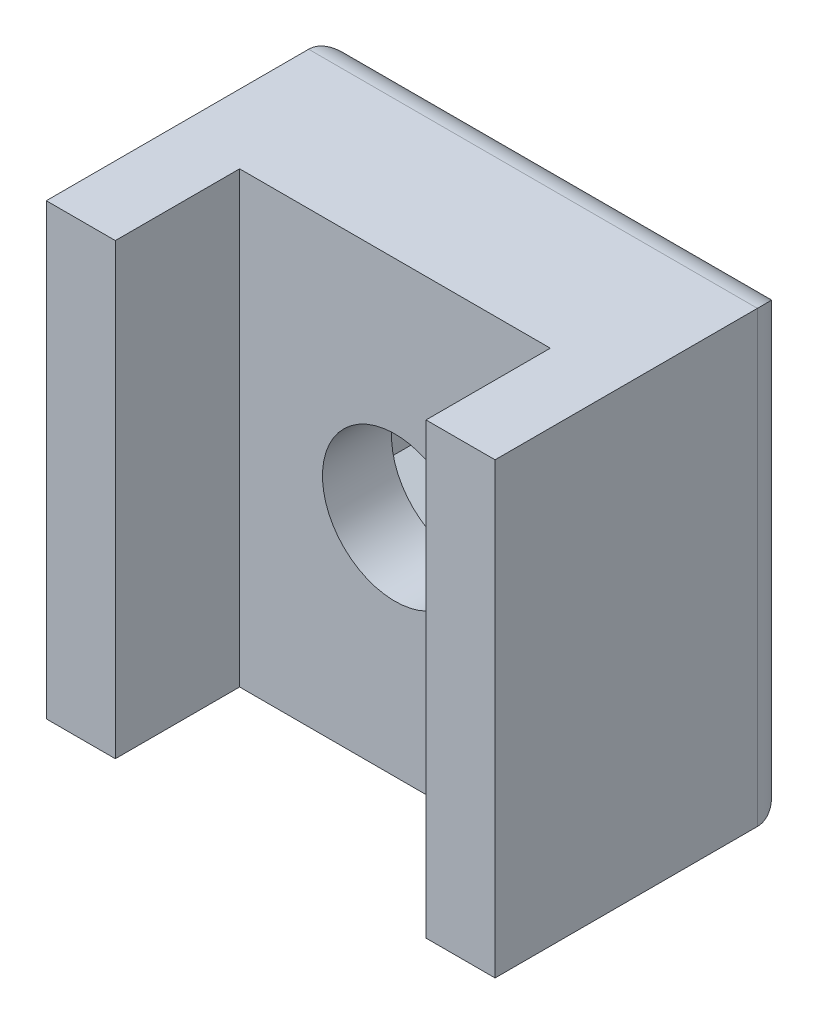
ISO-10303-21;
HEADER;
FILE_DESCRIPTION(('STEP AP214'),'2;1');
FILE_NAME('part.step','',(''),(''),'','','');
FILE_SCHEMA(('AUTOMOTIVE_DESIGN { 1 0 10303 214 1 1 1 1 }'));
ENDSEC;
DATA;
#1=APPLICATION_CONTEXT('core data for automotive mechanical design processes');
#2=APPLICATION_PROTOCOL_DEFINITION('international standard','automotive_design',2000,#1);
#3=PRODUCT_CONTEXT('',#1,'mechanical');
#4=PRODUCT('Part','Part','',(#3));
#5=PRODUCT_RELATED_PRODUCT_CATEGORY('part','',(#4));
#6=PRODUCT_DEFINITION_FORMATION('','',#4);
#7=PRODUCT_DEFINITION_CONTEXT('part definition',#1,'design');
#8=PRODUCT_DEFINITION('design','',#6,#7);
#9=PRODUCT_DEFINITION_SHAPE('','',#8);
#10=(LENGTH_UNIT() NAMED_UNIT(*) SI_UNIT(.MILLI.,.METRE.));
#11=(NAMED_UNIT(*) PLANE_ANGLE_UNIT() SI_UNIT($,.RADIAN.));
#12=(NAMED_UNIT(*) SI_UNIT($,.STERADIAN.) SOLID_ANGLE_UNIT());
#13=UNCERTAINTY_MEASURE_WITH_UNIT(LENGTH_MEASURE(1.E-05),#10,'distance_accuracy_value','');
#14=(GEOMETRIC_REPRESENTATION_CONTEXT(3) GLOBAL_UNCERTAINTY_ASSIGNED_CONTEXT((#13)) GLOBAL_UNIT_ASSIGNED_CONTEXT((#10,
#11,#12)) REPRESENTATION_CONTEXT('',''));
#15=CARTESIAN_POINT('',(0.,0.,0.));
#16=DIRECTION('',(0.,0.,1.));
#17=DIRECTION('',(1.,0.,0.));
#18=AXIS2_PLACEMENT_3D('',#15,#16,#17);
#19=CARTESIAN_POINT('',(0.,0.,5.6));
#20=DIRECTION('',(0.,0.,-1.));
#21=DIRECTION('',(-1.,0.,0.));
#22=AXIS2_PLACEMENT_3D('',#19,#20,#21);
#23=PLANE('',#22);
#24=DIRECTION('',(-1.,0.,0.));
#25=VECTOR('',#24,1.);
#26=CARTESIAN_POINT('',(-6.5,6.5,5.6));
#27=LINE('',#26,#25);
#28=CARTESIAN_POINT('',(6.5,6.5,5.6));
#29=VERTEX_POINT('',#28);
#30=CARTESIAN_POINT('',(4.5,6.5,5.6));
#31=VERTEX_POINT('',#30);
#32=EDGE_CURVE('E242',#29,#31,#27,.T.);
#33=ORIENTED_EDGE('',*,*,#32,.T.);
#34=DIRECTION('',(0.,1.,0.));
#35=VECTOR('',#34,1.);
#36=CARTESIAN_POINT('',(4.5,-6.5,5.6));
#37=LINE('',#36,#35);
#38=CARTESIAN_POINT('',(4.5,-6.5,5.6));
#39=VERTEX_POINT('',#38);
#40=EDGE_CURVE('E210',#39,#31,#37,.T.);
#41=ORIENTED_EDGE('',*,*,#40,.F.);
#42=DIRECTION('',(1.,0.,0.));
#43=VECTOR('',#42,1.);
#44=CARTESIAN_POINT('',(-6.5,-6.5,5.6));
#45=LINE('',#44,#43);
#46=CARTESIAN_POINT('',(6.5,-6.5,5.6));
#47=VERTEX_POINT('',#46);
#48=EDGE_CURVE('E247',#39,#47,#45,.T.);
#49=ORIENTED_EDGE('',*,*,#48,.T.);
#50=DIRECTION('',(0.,1.,0.));
#51=VECTOR('',#50,1.);
#52=CARTESIAN_POINT('',(6.5,-6.5,5.6));
#53=LINE('',#52,#51);
#54=EDGE_CURVE('E231',#47,#29,#53,.T.);
#55=ORIENTED_EDGE('',*,*,#54,.T.);
#56=EDGE_LOOP('',(#33,#41,#49,#55));
#57=FACE_BOUND('',#56,.T.);
#58=ADVANCED_FACE('F33',(#57),#23,.F.);
#59=CARTESIAN_POINT('',(6.5,-6.5,5.6));
#60=DIRECTION('',(-1.,0.,0.));
#61=DIRECTION('',(0.,0.,1.));
#62=AXIS2_PLACEMENT_3D('',#59,#60,#61);
#63=PLANE('',#62);
#64=DIRECTION('',(0.,0.,-1.));
#65=VECTOR('',#64,1.);
#66=CARTESIAN_POINT('',(6.5,-6.5,5.6));
#67=LINE('',#66,#65);
#68=CARTESIAN_POINT('',(6.5,-6.5,-2.));
#69=VERTEX_POINT('',#68);
#70=EDGE_CURVE('E251',#47,#69,#67,.T.);
#71=ORIENTED_EDGE('',*,*,#70,.T.);
#72=DIRECTION('',(0.,-1.,0.));
#73=VECTOR('',#72,1.);
#74=CARTESIAN_POINT('',(6.5,6.5,-2.));
#75=LINE('',#74,#73);
#76=CARTESIAN_POINT('',(6.5,6.5,-2.));
#77=VERTEX_POINT('',#76);
#78=EDGE_CURVE('E50',#69,#77,#75,.F.);
#79=ORIENTED_EDGE('',*,*,#78,.T.);
#80=DIRECTION('',(0.,0.,-1.));
#81=VECTOR('',#80,1.);
#82=CARTESIAN_POINT('',(6.5,6.5,5.6));
#83=LINE('',#82,#81);
#84=EDGE_CURVE('E258',#29,#77,#83,.T.);
#85=ORIENTED_EDGE('',*,*,#84,.F.);
#86=ORIENTED_EDGE('',*,*,#54,.F.);
#87=EDGE_LOOP('',(#71,#79,#85,#86));
#88=FACE_BOUND('',#87,.T.);
#89=ADVANCED_FACE('F318',(#88),#63,.F.);
#90=CARTESIAN_POINT('',(-6.5,6.5,5.6));
#91=DIRECTION('',(0.,-1.,0.));
#92=DIRECTION('',(0.,0.,-1.));
#93=AXIS2_PLACEMENT_3D('',#90,#91,#92);
#94=PLANE('',#93);
#95=ORIENTED_EDGE('',*,*,#84,.T.);
#96=DIRECTION('',(1.,0.,0.));
#97=VECTOR('',#96,1.);
#98=CARTESIAN_POINT('',(-6.5,6.5,-2.));
#99=LINE('',#98,#97);
#100=CARTESIAN_POINT('',(-6.5,6.5,-2.));
#101=VERTEX_POINT('',#100);
#102=EDGE_CURVE('E11',#77,#101,#99,.F.);
#103=ORIENTED_EDGE('',*,*,#102,.T.);
#104=DIRECTION('',(0.,0.,-1.));
#105=VECTOR('',#104,1.);
#106=CARTESIAN_POINT('',(-6.5,6.5,5.6));
#107=LINE('',#106,#105);
#108=CARTESIAN_POINT('',(-6.5,6.5,5.6));
#109=VERTEX_POINT('',#108);
#110=EDGE_CURVE('E255',#109,#101,#107,.T.);
#111=ORIENTED_EDGE('',*,*,#110,.F.);
#112=CARTESIAN_POINT('',(-4.5,6.5,5.6));
#113=VERTEX_POINT('',#112);
#114=EDGE_CURVE('E241',#113,#109,#27,.T.);
#115=ORIENTED_EDGE('',*,*,#114,.F.);
#116=DIRECTION('',(0.,0.,1.));
#117=VECTOR('',#116,1.);
#118=CARTESIAN_POINT('',(-4.5,6.5,2.));
#119=LINE('',#118,#117);
#120=CARTESIAN_POINT('',(-4.5,6.5,2.));
#121=VERTEX_POINT('',#120);
#122=EDGE_CURVE('E235',#121,#113,#119,.T.);
#123=ORIENTED_EDGE('',*,*,#122,.F.);
#124=DIRECTION('',(-1.,0.,0.));
#125=VECTOR('',#124,1.);
#126=CARTESIAN_POINT('',(-4.5,6.5,2.));
#127=LINE('',#126,#125);
#128=CARTESIAN_POINT('',(4.5,6.5,2.));
#129=VERTEX_POINT('',#128);
#130=EDGE_CURVE('E216',#129,#121,#127,.T.);
#131=ORIENTED_EDGE('',*,*,#130,.F.);
#132=DIRECTION('',(0.,0.,1.));
#133=VECTOR('',#132,1.);
#134=CARTESIAN_POINT('',(4.5,6.5,2.));
#135=LINE('',#134,#133);
#136=EDGE_CURVE('E226',#129,#31,#135,.T.);
#137=ORIENTED_EDGE('',*,*,#136,.T.);
#138=ORIENTED_EDGE('',*,*,#32,.F.);
#139=EDGE_LOOP('',(#95,#103,#111,#115,#123,#131,#137,#138));
#140=FACE_BOUND('',#139,.T.);
#141=ADVANCED_FACE('F295',(#140),#94,.F.);
#142=CARTESIAN_POINT('',(-6.5,-6.5,5.6));
#143=DIRECTION('',(1.,0.,0.));
#144=DIRECTION('',(0.,0.,-1.));
#145=AXIS2_PLACEMENT_3D('',#142,#143,#144);
#146=PLANE('',#145);
#147=ORIENTED_EDGE('',*,*,#110,.T.);
#148=DIRECTION('',(0.,1.,0.));
#149=VECTOR('',#148,1.);
#150=CARTESIAN_POINT('',(-6.5,-6.5,-2.));
#151=LINE('',#150,#149);
#152=CARTESIAN_POINT('',(-6.5,-6.5,-2.));
#153=VERTEX_POINT('',#152);
#154=EDGE_CURVE('E269',#101,#153,#151,.F.);
#155=ORIENTED_EDGE('',*,*,#154,.T.);
#156=DIRECTION('',(0.,0.,-1.));
#157=VECTOR('',#156,1.);
#158=CARTESIAN_POINT('',(-6.5,-6.5,5.6));
#159=LINE('',#158,#157);
#160=CARTESIAN_POINT('',(-6.5,-6.5,5.6));
#161=VERTEX_POINT('',#160);
#162=EDGE_CURVE('E253',#161,#153,#159,.T.);
#163=ORIENTED_EDGE('',*,*,#162,.F.);
#164=DIRECTION('',(0.,-1.,0.));
#165=VECTOR('',#164,1.);
#166=CARTESIAN_POINT('',(-6.5,-6.5,5.6));
#167=LINE('',#166,#165);
#168=EDGE_CURVE('E245',#109,#161,#167,.T.);
#169=ORIENTED_EDGE('',*,*,#168,.F.);
#170=EDGE_LOOP('',(#147,#155,#163,#169));
#171=FACE_BOUND('',#170,.T.);
#172=ADVANCED_FACE('F300',(#171),#146,.F.);
#173=CARTESIAN_POINT('',(-6.5,-6.5,5.6));
#174=DIRECTION('',(0.,1.,0.));
#175=DIRECTION('',(0.,0.,1.));
#176=AXIS2_PLACEMENT_3D('',#173,#174,#175);
#177=PLANE('',#176);
#178=ORIENTED_EDGE('',*,*,#162,.T.);
#179=DIRECTION('',(-1.,0.,0.));
#180=VECTOR('',#179,1.);
#181=CARTESIAN_POINT('',(6.5,-6.5,-2.));
#182=LINE('',#181,#180);
#183=EDGE_CURVE('E42',#153,#69,#182,.F.);
#184=ORIENTED_EDGE('',*,*,#183,.T.);
#185=ORIENTED_EDGE('',*,*,#70,.F.);
#186=ORIENTED_EDGE('',*,*,#48,.F.);
#187=DIRECTION('',(0.,0.,1.));
#188=VECTOR('',#187,1.);
#189=CARTESIAN_POINT('',(4.5,-6.5,2.));
#190=LINE('',#189,#188);
#191=CARTESIAN_POINT('',(4.5,-6.5,2.));
#192=VERTEX_POINT('',#191);
#193=EDGE_CURVE('E229',#192,#39,#190,.T.);
#194=ORIENTED_EDGE('',*,*,#193,.F.);
#195=DIRECTION('',(1.,0.,0.));
#196=VECTOR('',#195,1.);
#197=CARTESIAN_POINT('',(-4.5,-6.5,2.));
#198=LINE('',#197,#196);
#199=CARTESIAN_POINT('',(-4.5,-6.5,2.));
#200=VERTEX_POINT('',#199);
#201=EDGE_CURVE('E223',#200,#192,#198,.T.);
#202=ORIENTED_EDGE('',*,*,#201,.F.);
#203=DIRECTION('',(0.,0.,1.));
#204=VECTOR('',#203,1.);
#205=CARTESIAN_POINT('',(-4.5,-6.5,2.));
#206=LINE('',#205,#204);
#207=CARTESIAN_POINT('',(-4.5,-6.5,5.6));
#208=VERTEX_POINT('',#207);
#209=EDGE_CURVE('E232',#200,#208,#206,.T.);
#210=ORIENTED_EDGE('',*,*,#209,.T.);
#211=EDGE_CURVE('E248',#161,#208,#45,.T.);
#212=ORIENTED_EDGE('',*,*,#211,.F.);
#213=EDGE_LOOP('',(#178,#184,#185,#186,#194,#202,#210,#212));
#214=FACE_BOUND('',#213,.T.);
#215=ADVANCED_FACE('F330',(#214),#177,.F.);
#216=ORIENTED_EDGE('',*,*,#211,.T.);
#217=DIRECTION('',(0.,-1.,0.));
#218=VECTOR('',#217,1.);
#219=CARTESIAN_POINT('',(-4.5,-6.5,5.6));
#220=LINE('',#219,#218);
#221=EDGE_CURVE('E217',#113,#208,#220,.T.);
#222=ORIENTED_EDGE('',*,*,#221,.F.);
#223=ORIENTED_EDGE('',*,*,#114,.T.);
#224=ORIENTED_EDGE('',*,*,#168,.T.);
#225=EDGE_LOOP('',(#216,#222,#223,#224));
#226=FACE_BOUND('',#225,.T.);
#227=ADVANCED_FACE('F321',(#226),#23,.F.);
#228=CARTESIAN_POINT('',(0.,0.,0.));
#229=DIRECTION('',(0.,0.,-1.));
#230=DIRECTION('',(-1.,0.,0.));
#231=AXIS2_PLACEMENT_3D('',#228,#229,#230);
#232=PLANE('',#231);
#233=DIRECTION('',(0.,-1.,0.));
#234=VECTOR('',#233,1.);
#235=CARTESIAN_POINT('',(3.75,2.1650635094611,0.));
#236=LINE('',#235,#234);
#237=CARTESIAN_POINT('',(3.75,2.1650635094611,0.));
#238=VERTEX_POINT('',#237);
#239=CARTESIAN_POINT('',(3.75,-2.1650635094611,0.));
#240=VERTEX_POINT('',#239);
#241=EDGE_CURVE('E186',#238,#240,#236,.T.);
#242=ORIENTED_EDGE('',*,*,#241,.T.);
#243=DIRECTION('',(-0.866025403784438,-0.5,0.));
#244=VECTOR('',#243,1.);
#245=CARTESIAN_POINT('',(3.75,-2.1650635094611,0.));
#246=LINE('',#245,#244);
#247=CARTESIAN_POINT('',(0.,-4.33012701892219,0.));
#248=VERTEX_POINT('',#247);
#249=EDGE_CURVE('E168',#240,#248,#246,.T.);
#250=ORIENTED_EDGE('',*,*,#249,.T.);
#251=DIRECTION('',(-0.866025403784439,0.5,0.));
#252=VECTOR('',#251,1.);
#253=CARTESIAN_POINT('',(0.,-4.33012701892219,0.));
#254=LINE('',#253,#252);
#255=CARTESIAN_POINT('',(-3.75,-2.1650635094611,0.));
#256=VERTEX_POINT('',#255);
#257=EDGE_CURVE('E189',#248,#256,#254,.T.);
#258=ORIENTED_EDGE('',*,*,#257,.T.);
#259=DIRECTION('',(0.,1.,0.));
#260=VECTOR('',#259,1.);
#261=CARTESIAN_POINT('',(-3.75,-2.1650635094611,0.));
#262=LINE('',#261,#260);
#263=CARTESIAN_POINT('',(-3.75,2.1650635094611,0.));
#264=VERTEX_POINT('',#263);
#265=EDGE_CURVE('E191',#256,#264,#262,.T.);
#266=ORIENTED_EDGE('',*,*,#265,.T.);
#267=DIRECTION('',(0.866025403784438,0.500000000000001,0.));
#268=VECTOR('',#267,1.);
#269=CARTESIAN_POINT('',(-3.75,2.1650635094611,0.));
#270=LINE('',#269,#268);
#271=CARTESIAN_POINT('',(0.,4.3301270189222,0.));
#272=VERTEX_POINT('',#271);
#273=EDGE_CURVE('E193',#264,#272,#270,.T.);
#274=ORIENTED_EDGE('',*,*,#273,.T.);
#275=DIRECTION('',(0.866025403784439,-0.5,0.));
#276=VECTOR('',#275,1.);
#277=CARTESIAN_POINT('',(0.,4.3301270189222,0.));
#278=LINE('',#277,#276);
#279=EDGE_CURVE('E161',#272,#238,#278,.T.);
#280=ORIENTED_EDGE('',*,*,#279,.T.);
#281=EDGE_LOOP('',(#242,#250,#258,#266,#274,#280));
#282=FACE_BOUND('',#281,.T.);
#283=CARTESIAN_POINT('',(0.,0.,0.));
#284=DIRECTION('',(0.,0.,1.));
#285=DIRECTION('',(1.,0.,0.));
#286=AXIS2_PLACEMENT_3D('',#283,#284,#285);
#287=CIRCLE('',#286,2.1);
#288=CARTESIAN_POINT('',(2.1,0.,0.));
#289=VERTEX_POINT('',#288);
#290=EDGE_CURVE('E207',#289,#289,#287,.T.);
#291=ORIENTED_EDGE('',*,*,#290,.T.);
#292=EDGE_LOOP('',(#291));
#293=FACE_BOUND('',#292,.T.);
#294=ADVANCED_FACE('F329',(#282,#293),#232,.T.);
#295=CARTESIAN_POINT('',(4.5,-6.5,2.));
#296=DIRECTION('',(1.,0.,0.));
#297=DIRECTION('',(0.,0.,-1.));
#298=AXIS2_PLACEMENT_3D('',#295,#296,#297);
#299=PLANE('',#298);
#300=ORIENTED_EDGE('',*,*,#40,.T.);
#301=ORIENTED_EDGE('',*,*,#136,.F.);
#302=DIRECTION('',(0.,1.,0.));
#303=VECTOR('',#302,1.);
#304=CARTESIAN_POINT('',(4.5,-6.5,2.));
#305=LINE('',#304,#303);
#306=EDGE_CURVE('E213',#192,#129,#305,.T.);
#307=ORIENTED_EDGE('',*,*,#306,.F.);
#308=ORIENTED_EDGE('',*,*,#193,.T.);
#309=EDGE_LOOP('',(#300,#301,#307,#308));
#310=FACE_BOUND('',#309,.T.);
#311=ADVANCED_FACE('F336',(#310),#299,.F.);
#312=CARTESIAN_POINT('',(-4.5,-6.5,2.));
#313=DIRECTION('',(-1.,0.,0.));
#314=DIRECTION('',(0.,0.,1.));
#315=AXIS2_PLACEMENT_3D('',#312,#313,#314);
#316=PLANE('',#315);
#317=ORIENTED_EDGE('',*,*,#221,.T.);
#318=ORIENTED_EDGE('',*,*,#209,.F.);
#319=DIRECTION('',(0.,-1.,0.));
#320=VECTOR('',#319,1.);
#321=CARTESIAN_POINT('',(-4.5,-6.5,2.));
#322=LINE('',#321,#320);
#323=EDGE_CURVE('E220',#121,#200,#322,.T.);
#324=ORIENTED_EDGE('',*,*,#323,.F.);
#325=ORIENTED_EDGE('',*,*,#122,.T.);
#326=EDGE_LOOP('',(#317,#318,#324,#325));
#327=FACE_BOUND('',#326,.T.);
#328=ADVANCED_FACE('F344',(#327),#316,.F.);
#329=CARTESIAN_POINT('',(0.,0.,2.));
#330=DIRECTION('',(0.,0.,-1.));
#331=DIRECTION('',(-1.,0.,0.));
#332=AXIS2_PLACEMENT_3D('',#329,#330,#331);
#333=PLANE('',#332);
#334=CARTESIAN_POINT('',(0.,0.,2.));
#335=DIRECTION('',(0.,0.,1.));
#336=DIRECTION('',(1.,0.,0.));
#337=AXIS2_PLACEMENT_3D('',#334,#335,#336);
#338=CIRCLE('',#337,2.1);
#339=CARTESIAN_POINT('',(2.1,0.,2.));
#340=VERTEX_POINT('',#339);
#341=EDGE_CURVE('E169',#340,#340,#338,.T.);
#342=ORIENTED_EDGE('',*,*,#341,.F.);
#343=EDGE_LOOP('',(#342));
#344=FACE_BOUND('',#343,.T.);
#345=ORIENTED_EDGE('',*,*,#306,.T.);
#346=ORIENTED_EDGE('',*,*,#130,.T.);
#347=ORIENTED_EDGE('',*,*,#323,.T.);
#348=ORIENTED_EDGE('',*,*,#201,.T.);
#349=EDGE_LOOP('',(#345,#346,#347,#348));
#350=FACE_BOUND('',#349,.T.);
#351=ADVANCED_FACE('F314',(#344,#350),#333,.F.);
#352=CARTESIAN_POINT('',(0.,0.,0.));
#353=DIRECTION('',(0.,0.,1.));
#354=DIRECTION('',(1.,0.,0.));
#355=AXIS2_PLACEMENT_3D('',#352,#353,#354);
#356=CYLINDRICAL_SURFACE('',#355,2.1);
#357=ORIENTED_EDGE('',*,*,#290,.F.);
#358=EDGE_LOOP('',(#357));
#359=FACE_BOUND('',#358,.T.);
#360=ORIENTED_EDGE('',*,*,#341,.T.);
#361=EDGE_LOOP('',(#360));
#362=FACE_BOUND('',#361,.T.);
#363=ADVANCED_FACE('F307',(#359,#362),#356,.F.);
#364=CARTESIAN_POINT('',(0.,0.,-3.));
#365=DIRECTION('',(0.,0.,-1.));
#366=DIRECTION('',(-1.,0.,0.));
#367=AXIS2_PLACEMENT_3D('',#364,#365,#366);
#368=PLANE('',#367);
#369=DIRECTION('',(0.,-1.,0.));
#370=VECTOR('',#369,1.);
#371=CARTESIAN_POINT('',(5.5,-6.5,-3.));
#372=LINE('',#371,#370);
#373=CARTESIAN_POINT('',(5.5,5.5,-3.));
#374=VERTEX_POINT('',#373);
#375=CARTESIAN_POINT('',(5.5,-5.5,-3.));
#376=VERTEX_POINT('',#375);
#377=EDGE_CURVE('E262',#374,#376,#372,.T.);
#378=ORIENTED_EDGE('',*,*,#377,.T.);
#379=DIRECTION('',(-1.,0.,0.));
#380=VECTOR('',#379,1.);
#381=CARTESIAN_POINT('',(-6.5,-5.5,-3.));
#382=LINE('',#381,#380);
#383=CARTESIAN_POINT('',(-5.5,-5.5,-3.));
#384=VERTEX_POINT('',#383);
#385=EDGE_CURVE('E267',#376,#384,#382,.T.);
#386=ORIENTED_EDGE('',*,*,#385,.T.);
#387=DIRECTION('',(0.,1.,0.));
#388=VECTOR('',#387,1.);
#389=CARTESIAN_POINT('',(-5.5,6.5,-3.));
#390=LINE('',#389,#388);
#391=CARTESIAN_POINT('',(-5.5,5.5,-3.));
#392=VERTEX_POINT('',#391);
#393=EDGE_CURVE('E264',#384,#392,#390,.T.);
#394=ORIENTED_EDGE('',*,*,#393,.T.);
#395=DIRECTION('',(1.,0.,0.));
#396=VECTOR('',#395,1.);
#397=CARTESIAN_POINT('',(6.5,5.5,-3.));
#398=LINE('',#397,#396);
#399=EDGE_CURVE('E260',#392,#374,#398,.T.);
#400=ORIENTED_EDGE('',*,*,#399,.T.);
#401=EDGE_LOOP('',(#378,#386,#394,#400));
#402=FACE_BOUND('',#401,.T.);
#403=DIRECTION('',(-0.866025403784438,-0.5,0.));
#404=VECTOR('',#403,1.);
#405=CARTESIAN_POINT('',(3.75,-2.1650635094611,-3.));
#406=LINE('',#405,#404);
#407=CARTESIAN_POINT('',(3.75,-2.1650635094611,-3.));
#408=VERTEX_POINT('',#407);
#409=CARTESIAN_POINT('',(0.,-4.33012701892219,-3.));
#410=VERTEX_POINT('',#409);
#411=EDGE_CURVE('E160',#408,#410,#406,.T.);
#412=ORIENTED_EDGE('',*,*,#411,.F.);
#413=DIRECTION('',(0.,-1.,0.));
#414=VECTOR('',#413,1.);
#415=CARTESIAN_POINT('',(3.75,2.1650635094611,-3.));
#416=LINE('',#415,#414);
#417=CARTESIAN_POINT('',(3.75,2.1650635094611,-3.));
#418=VERTEX_POINT('',#417);
#419=EDGE_CURVE('E150',#418,#408,#416,.T.);
#420=ORIENTED_EDGE('',*,*,#419,.F.);
#421=DIRECTION('',(0.866025403784439,-0.5,0.));
#422=VECTOR('',#421,1.);
#423=CARTESIAN_POINT('',(0.,4.3301270189222,-3.));
#424=LINE('',#423,#422);
#425=CARTESIAN_POINT('',(0.,4.3301270189222,-3.));
#426=VERTEX_POINT('',#425);
#427=EDGE_CURVE('E184',#426,#418,#424,.T.);
#428=ORIENTED_EDGE('',*,*,#427,.F.);
#429=DIRECTION('',(0.866025403784438,0.500000000000001,0.));
#430=VECTOR('',#429,1.);
#431=CARTESIAN_POINT('',(-3.75,2.1650635094611,-3.));
#432=LINE('',#431,#430);
#433=CARTESIAN_POINT('',(-3.75,2.1650635094611,-3.));
#434=VERTEX_POINT('',#433);
#435=EDGE_CURVE('E181',#434,#426,#432,.T.);
#436=ORIENTED_EDGE('',*,*,#435,.F.);
#437=DIRECTION('',(0.,1.,0.));
#438=VECTOR('',#437,1.);
#439=CARTESIAN_POINT('',(-3.75,-2.1650635094611,-3.));
#440=LINE('',#439,#438);
#441=CARTESIAN_POINT('',(-3.75,-2.1650635094611,-3.));
#442=VERTEX_POINT('',#441);
#443=EDGE_CURVE('E177',#442,#434,#440,.T.);
#444=ORIENTED_EDGE('',*,*,#443,.F.);
#445=DIRECTION('',(-0.866025403784439,0.5,0.));
#446=VECTOR('',#445,1.);
#447=CARTESIAN_POINT('',(0.,-4.33012701892219,-3.));
#448=LINE('',#447,#446);
#449=EDGE_CURVE('E175',#410,#442,#448,.T.);
#450=ORIENTED_EDGE('',*,*,#449,.F.);
#451=EDGE_LOOP('',(#412,#420,#428,#436,#444,#450));
#452=FACE_BOUND('',#451,.T.);
#453=ADVANCED_FACE('F173',(#402,#452),#368,.T.);
#454=CARTESIAN_POINT('',(3.75,2.1650635094611,-3.));
#455=DIRECTION('',(-1.,0.,0.));
#456=DIRECTION('',(0.,-1.,0.));
#457=AXIS2_PLACEMENT_3D('',#454,#455,#456);
#458=PLANE('',#457);
#459=ORIENTED_EDGE('',*,*,#241,.F.);
#460=DIRECTION('',(0.,0.,1.));
#461=VECTOR('',#460,1.);
#462=CARTESIAN_POINT('',(3.75,2.1650635094611,-3.));
#463=LINE('',#462,#461);
#464=EDGE_CURVE('E156',#418,#238,#463,.T.);
#465=ORIENTED_EDGE('',*,*,#464,.F.);
#466=ORIENTED_EDGE('',*,*,#419,.T.);
#467=DIRECTION('',(0.,0.,1.));
#468=VECTOR('',#467,1.);
#469=CARTESIAN_POINT('',(3.75,-2.1650635094611,-3.));
#470=LINE('',#469,#468);
#471=EDGE_CURVE('E154',#408,#240,#470,.T.);
#472=ORIENTED_EDGE('',*,*,#471,.T.);
#473=EDGE_LOOP('',(#459,#465,#466,#472));
#474=FACE_BOUND('',#473,.T.);
#475=ADVANCED_FACE('F153',(#474),#458,.T.);
#476=CARTESIAN_POINT('',(3.75,-2.1650635094611,-3.));
#477=DIRECTION('',(-0.5,0.866025403784438,0.));
#478=DIRECTION('',(-0.866025403784438,-0.5,0.));
#479=AXIS2_PLACEMENT_3D('',#476,#477,#478);
#480=PLANE('',#479);
#481=ORIENTED_EDGE('',*,*,#249,.F.);
#482=ORIENTED_EDGE('',*,*,#471,.F.);
#483=ORIENTED_EDGE('',*,*,#411,.T.);
#484=DIRECTION('',(0.,0.,1.));
#485=VECTOR('',#484,1.);
#486=CARTESIAN_POINT('',(0.,-4.33012701892219,-3.));
#487=LINE('',#486,#485);
#488=EDGE_CURVE('E170',#410,#248,#487,.T.);
#489=ORIENTED_EDGE('',*,*,#488,.T.);
#490=EDGE_LOOP('',(#481,#482,#483,#489));
#491=FACE_BOUND('',#490,.T.);
#492=ADVANCED_FACE('F165',(#491),#480,.T.);
#493=CARTESIAN_POINT('',(0.,-4.33012701892219,-3.));
#494=DIRECTION('',(0.5,0.866025403784439,0.));
#495=DIRECTION('',(-0.866025403784439,0.5,0.));
#496=AXIS2_PLACEMENT_3D('',#493,#494,#495);
#497=PLANE('',#496);
#498=ORIENTED_EDGE('',*,*,#257,.F.);
#499=ORIENTED_EDGE('',*,*,#488,.F.);
#500=ORIENTED_EDGE('',*,*,#449,.T.);
#501=DIRECTION('',(0.,0.,1.));
#502=VECTOR('',#501,1.);
#503=CARTESIAN_POINT('',(-3.75,-2.1650635094611,-3.));
#504=LINE('',#503,#502);
#505=EDGE_CURVE('E203',#442,#256,#504,.T.);
#506=ORIENTED_EDGE('',*,*,#505,.T.);
#507=EDGE_LOOP('',(#498,#499,#500,#506));
#508=FACE_BOUND('',#507,.T.);
#509=ADVANCED_FACE('F395',(#508),#497,.T.);
#510=CARTESIAN_POINT('',(-3.75,-2.1650635094611,-3.));
#511=DIRECTION('',(1.,0.,0.));
#512=DIRECTION('',(0.,1.,0.));
#513=AXIS2_PLACEMENT_3D('',#510,#511,#512);
#514=PLANE('',#513);
#515=ORIENTED_EDGE('',*,*,#265,.F.);
#516=ORIENTED_EDGE('',*,*,#505,.F.);
#517=ORIENTED_EDGE('',*,*,#443,.T.);
#518=DIRECTION('',(0.,0.,1.));
#519=VECTOR('',#518,1.);
#520=CARTESIAN_POINT('',(-3.75,2.1650635094611,-3.));
#521=LINE('',#520,#519);
#522=EDGE_CURVE('E200',#434,#264,#521,.T.);
#523=ORIENTED_EDGE('',*,*,#522,.T.);
#524=EDGE_LOOP('',(#515,#516,#517,#523));
#525=FACE_BOUND('',#524,.T.);
#526=ADVANCED_FACE('F404',(#525),#514,.T.);
#527=CARTESIAN_POINT('',(-3.75,2.1650635094611,-3.));
#528=DIRECTION('',(0.500000000000001,-0.866025403784438,0.));
#529=DIRECTION('',(0.866025403784438,0.500000000000001,0.));
#530=AXIS2_PLACEMENT_3D('',#527,#528,#529);
#531=PLANE('',#530);
#532=ORIENTED_EDGE('',*,*,#273,.F.);
#533=ORIENTED_EDGE('',*,*,#522,.F.);
#534=ORIENTED_EDGE('',*,*,#435,.T.);
#535=DIRECTION('',(0.,0.,1.));
#536=VECTOR('',#535,1.);
#537=CARTESIAN_POINT('',(0.,4.3301270189222,-3.));
#538=LINE('',#537,#536);
#539=EDGE_CURVE('E197',#426,#272,#538,.T.);
#540=ORIENTED_EDGE('',*,*,#539,.T.);
#541=EDGE_LOOP('',(#532,#533,#534,#540));
#542=FACE_BOUND('',#541,.T.);
#543=ADVANCED_FACE('F414',(#542),#531,.T.);
#544=CARTESIAN_POINT('',(0.,4.3301270189222,-3.));
#545=DIRECTION('',(-0.5,-0.866025403784439,0.));
#546=DIRECTION('',(0.866025403784439,-0.5,0.));
#547=AXIS2_PLACEMENT_3D('',#544,#545,#546);
#548=PLANE('',#547);
#549=ORIENTED_EDGE('',*,*,#279,.F.);
#550=ORIENTED_EDGE('',*,*,#539,.F.);
#551=ORIENTED_EDGE('',*,*,#427,.T.);
#552=ORIENTED_EDGE('',*,*,#464,.T.);
#553=EDGE_LOOP('',(#549,#550,#551,#552));
#554=FACE_BOUND('',#553,.T.);
#555=ADVANCED_FACE('F424',(#554),#548,.T.);
#556=CARTESIAN_POINT('',(5.5,0.,-2.));
#557=DIRECTION('',(0.,1.,0.));
#558=DIRECTION('',(0.,0.,1.));
#559=AXIS2_PLACEMENT_3D('',#556,#557,#558);
#560=CYLINDRICAL_SURFACE('',#559,1.);
#561=CARTESIAN_POINT('',(5.5,5.5,-2.));
#562=DIRECTION('',(-0.707106781186547,0.707106781186547,0.));
#563=DIRECTION('',(-0.707106781186547,-0.707106781186547,0.));
#564=AXIS2_PLACEMENT_3D('',#561,#562,#563);
#565=ELLIPSE('',#564,1.41421356237309,1.);
#566=EDGE_CURVE('E277',#77,#374,#565,.T.);
#567=ORIENTED_EDGE('',*,*,#566,.F.);
#568=ORIENTED_EDGE('',*,*,#78,.F.);
#569=CARTESIAN_POINT('',(5.5,-5.5,-2.));
#570=DIRECTION('',(0.707106781186547,0.707106781186547,0.));
#571=DIRECTION('',(0.707106781186547,-0.707106781186547,0.));
#572=AXIS2_PLACEMENT_3D('',#569,#570,#571);
#573=ELLIPSE('',#572,1.41421356237309,1.);
#574=EDGE_CURVE('E37',#376,#69,#573,.F.);
#575=ORIENTED_EDGE('',*,*,#574,.F.);
#576=ORIENTED_EDGE('',*,*,#377,.F.);
#577=EDGE_LOOP('',(#567,#568,#575,#576));
#578=FACE_BOUND('',#577,.T.);
#579=ADVANCED_FACE('F35',(#578),#560,.T.);
#580=CARTESIAN_POINT('',(0.,-5.5,-2.));
#581=DIRECTION('',(1.,0.,0.));
#582=DIRECTION('',(0.,0.,-1.));
#583=AXIS2_PLACEMENT_3D('',#580,#581,#582);
#584=CYLINDRICAL_SURFACE('',#583,1.);
#585=ORIENTED_EDGE('',*,*,#574,.T.);
#586=ORIENTED_EDGE('',*,*,#183,.F.);
#587=CARTESIAN_POINT('',(-5.5,-5.5,-2.));
#588=DIRECTION('',(0.707106781186547,-0.707106781186547,0.));
#589=DIRECTION('',(0.707106781186547,0.707106781186547,0.));
#590=AXIS2_PLACEMENT_3D('',#587,#588,#589);
#591=ELLIPSE('',#590,1.41421356237309,1.);
#592=EDGE_CURVE('E276',#384,#153,#591,.F.);
#593=ORIENTED_EDGE('',*,*,#592,.F.);
#594=ORIENTED_EDGE('',*,*,#385,.F.);
#595=EDGE_LOOP('',(#585,#586,#593,#594));
#596=FACE_BOUND('',#595,.T.);
#597=ADVANCED_FACE('F287',(#596),#584,.T.);
#598=CARTESIAN_POINT('',(0.,5.5,-2.));
#599=DIRECTION('',(-1.,0.,0.));
#600=DIRECTION('',(0.,0.,1.));
#601=AXIS2_PLACEMENT_3D('',#598,#599,#600);
#602=CYLINDRICAL_SURFACE('',#601,1.);
#603=ORIENTED_EDGE('',*,*,#566,.T.);
#604=ORIENTED_EDGE('',*,*,#399,.F.);
#605=CARTESIAN_POINT('',(-5.5,5.5,-2.));
#606=DIRECTION('',(-0.707106781186547,-0.707106781186547,0.));
#607=DIRECTION('',(-0.707106781186547,0.707106781186547,0.));
#608=AXIS2_PLACEMENT_3D('',#605,#606,#607);
#609=ELLIPSE('',#608,1.41421356237309,1.);
#610=EDGE_CURVE('E274',#101,#392,#609,.T.);
#611=ORIENTED_EDGE('',*,*,#610,.F.);
#612=ORIENTED_EDGE('',*,*,#102,.F.);
#613=EDGE_LOOP('',(#603,#604,#611,#612));
#614=FACE_BOUND('',#613,.T.);
#615=ADVANCED_FACE('F292',(#614),#602,.T.);
#616=CARTESIAN_POINT('',(-5.5,0.,-2.));
#617=DIRECTION('',(0.,-1.,0.));
#618=DIRECTION('',(0.,0.,-1.));
#619=AXIS2_PLACEMENT_3D('',#616,#617,#618);
#620=CYLINDRICAL_SURFACE('',#619,1.);
#621=ORIENTED_EDGE('',*,*,#592,.T.);
#622=ORIENTED_EDGE('',*,*,#154,.F.);
#623=ORIENTED_EDGE('',*,*,#610,.T.);
#624=ORIENTED_EDGE('',*,*,#393,.F.);
#625=EDGE_LOOP('',(#621,#622,#623,#624));
#626=FACE_BOUND('',#625,.T.);
#627=ADVANCED_FACE('F303',(#626),#620,.T.);
#628=CLOSED_SHELL('',(#58,#89,#141,#172,#215,#227,#294,#311,#328,#351,#363,#453,#475,#492,#509,
#526,#543,#555,#579,#597,#615,#627));
#629=MANIFOLD_SOLID_BREP('B2',#628);
#630=ADVANCED_BREP_SHAPE_REPRESENTATION('',(#18,#629),#14);
#631=SHAPE_DEFINITION_REPRESENTATION(#9,#630);
ENDSEC;
END-ISO-10303-21;
